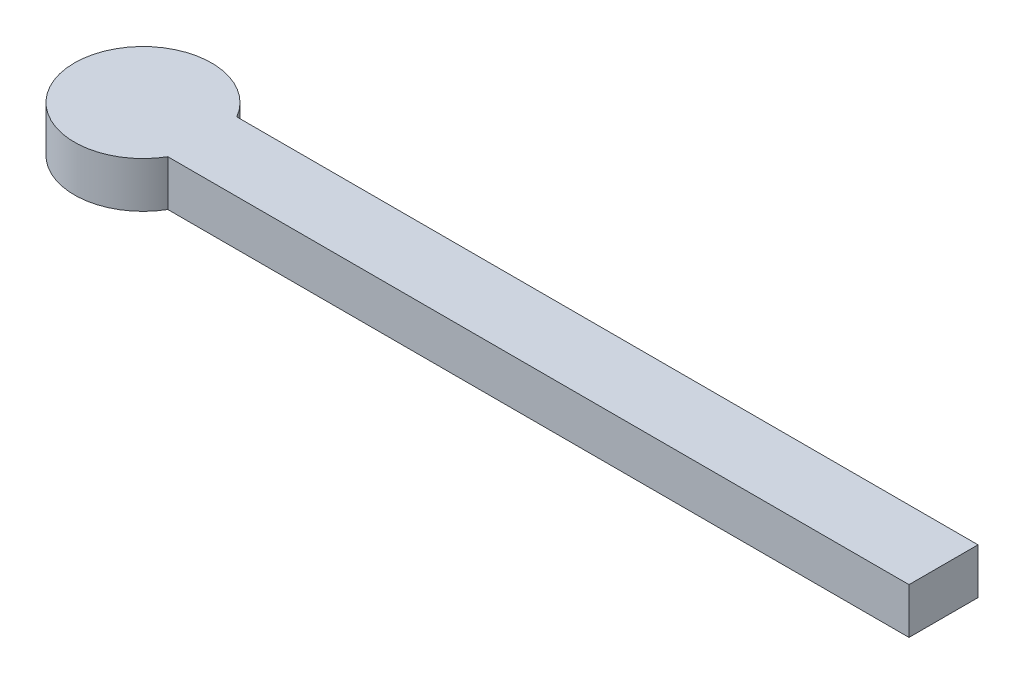
ISO-10303-21;
HEADER;
FILE_DESCRIPTION(('STEP AP214'),'2;1');
FILE_NAME('part.step','',(''),(''),'','','');
FILE_SCHEMA(('AUTOMOTIVE_DESIGN { 1 0 10303 214 1 1 1 1 }'));
ENDSEC;
DATA;
#1=APPLICATION_CONTEXT('core data for automotive mechanical design processes');
#2=APPLICATION_PROTOCOL_DEFINITION('international standard','automotive_design',2000,#1);
#3=PRODUCT_CONTEXT('',#1,'mechanical');
#4=PRODUCT('Part','Part','',(#3));
#5=PRODUCT_RELATED_PRODUCT_CATEGORY('part','',(#4));
#6=PRODUCT_DEFINITION_FORMATION('','',#4);
#7=PRODUCT_DEFINITION_CONTEXT('part definition',#1,'design');
#8=PRODUCT_DEFINITION('design','',#6,#7);
#9=PRODUCT_DEFINITION_SHAPE('','',#8);
#10=(LENGTH_UNIT() NAMED_UNIT(*) SI_UNIT(.MILLI.,.METRE.));
#11=(NAMED_UNIT(*) PLANE_ANGLE_UNIT() SI_UNIT($,.RADIAN.));
#12=(NAMED_UNIT(*) SI_UNIT($,.STERADIAN.) SOLID_ANGLE_UNIT());
#13=UNCERTAINTY_MEASURE_WITH_UNIT(LENGTH_MEASURE(1.E-05),#10,'distance_accuracy_value','');
#14=(GEOMETRIC_REPRESENTATION_CONTEXT(3) GLOBAL_UNCERTAINTY_ASSIGNED_CONTEXT((#13)) GLOBAL_UNIT_ASSIGNED_CONTEXT((#10,
#11,#12)) REPRESENTATION_CONTEXT('',''));
#15=CARTESIAN_POINT('',(0.,0.,0.));
#16=DIRECTION('',(0.,0.,1.));
#17=DIRECTION('',(1.,0.,0.));
#18=AXIS2_PLACEMENT_3D('',#15,#16,#17);
#19=CARTESIAN_POINT('',(0.,10.,0.));
#20=DIRECTION('',(0.,-1.,0.));
#21=DIRECTION('',(0.,0.,-1.));
#22=AXIS2_PLACEMENT_3D('',#19,#20,#21);
#23=CYLINDRICAL_SURFACE('',#22,15.);
#24=CARTESIAN_POINT('',(0.,0.,0.));
#25=DIRECTION('',(0.,1.,0.));
#26=DIRECTION('',(0.,0.,1.));
#27=AXIS2_PLACEMENT_3D('',#24,#25,#26);
#28=CIRCLE('',#27,15.);
#29=CARTESIAN_POINT('',(12.9676078002629,0.,-7.53930686061795));
#30=VERTEX_POINT('',#29);
#31=CARTESIAN_POINT('',(12.9676078002629,0.,7.53930686061795));
#32=VERTEX_POINT('',#31);
#33=EDGE_CURVE('E107',#30,#32,#28,.T.);
#34=ORIENTED_EDGE('',*,*,#33,.T.);
#35=DIRECTION('',(0.,-1.,0.));
#36=VECTOR('',#35,1.);
#37=CARTESIAN_POINT('',(12.9676078002629,10.,7.53930686061795));
#38=LINE('',#37,#36);
#39=CARTESIAN_POINT('',(12.9676078002629,10.,7.53930686061795));
#40=VERTEX_POINT('',#39);
#41=EDGE_CURVE('E11',#40,#32,#38,.T.);
#42=ORIENTED_EDGE('',*,*,#41,.F.);
#43=CARTESIAN_POINT('',(0.,10.,0.));
#44=DIRECTION('',(0.,1.,0.));
#45=DIRECTION('',(0.,0.,1.));
#46=AXIS2_PLACEMENT_3D('',#43,#44,#45);
#47=CIRCLE('',#46,15.);
#48=CARTESIAN_POINT('',(12.9676078002629,10.,-7.53930686061795));
#49=VERTEX_POINT('',#48);
#50=EDGE_CURVE('E91',#49,#40,#47,.T.);
#51=ORIENTED_EDGE('',*,*,#50,.F.);
#52=DIRECTION('',(0.,-1.,0.));
#53=VECTOR('',#52,1.);
#54=CARTESIAN_POINT('',(12.9676078002629,10.,-7.53930686061795));
#55=LINE('',#54,#53);
#56=EDGE_CURVE('E103',#49,#30,#55,.T.);
#57=ORIENTED_EDGE('',*,*,#56,.T.);
#58=EDGE_LOOP('',(#34,#42,#51,#57));
#59=FACE_BOUND('',#58,.T.);
#60=ADVANCED_FACE('F39',(#59),#23,.T.);
#61=CARTESIAN_POINT('',(174.957909360127,10.,7.53930686061795));
#62=DIRECTION('',(0.,0.,-1.));
#63=DIRECTION('',(-1.,0.,0.));
#64=AXIS2_PLACEMENT_3D('',#61,#62,#63);
#65=PLANE('',#64);
#66=DIRECTION('',(1.,0.,0.));
#67=VECTOR('',#66,1.);
#68=CARTESIAN_POINT('',(174.957909360127,0.,7.53930686061795));
#69=LINE('',#68,#67);
#70=CARTESIAN_POINT('',(174.957909360127,0.,7.53930686061795));
#71=VERTEX_POINT('',#70);
#72=EDGE_CURVE('E96',#32,#71,#69,.T.);
#73=ORIENTED_EDGE('',*,*,#72,.T.);
#74=DIRECTION('',(0.,-1.,0.));
#75=VECTOR('',#74,1.);
#76=CARTESIAN_POINT('',(174.957909360127,10.,7.53930686061795));
#77=LINE('',#76,#75);
#78=CARTESIAN_POINT('',(174.957909360127,10.,7.53930686061795));
#79=VERTEX_POINT('',#78);
#80=EDGE_CURVE('E48',#79,#71,#77,.T.);
#81=ORIENTED_EDGE('',*,*,#80,.F.);
#82=DIRECTION('',(1.,0.,0.));
#83=VECTOR('',#82,1.);
#84=CARTESIAN_POINT('',(174.957909360127,10.,7.53930686061795));
#85=LINE('',#84,#83);
#86=EDGE_CURVE('E86',#40,#79,#85,.T.);
#87=ORIENTED_EDGE('',*,*,#86,.F.);
#88=ORIENTED_EDGE('',*,*,#41,.T.);
#89=EDGE_LOOP('',(#73,#81,#87,#88));
#90=FACE_BOUND('',#89,.T.);
#91=ADVANCED_FACE('F95',(#90),#65,.F.);
#92=CARTESIAN_POINT('',(174.957909360127,10.,7.53930686061795));
#93=DIRECTION('',(-1.,0.,0.));
#94=DIRECTION('',(0.,0.,1.));
#95=AXIS2_PLACEMENT_3D('',#92,#93,#94);
#96=PLANE('',#95);
#97=DIRECTION('',(0.,0.,-1.));
#98=VECTOR('',#97,1.);
#99=CARTESIAN_POINT('',(174.957909360127,0.,7.53930686061795));
#100=LINE('',#99,#98);
#101=CARTESIAN_POINT('',(174.957909360127,0.,-7.53930686061795));
#102=VERTEX_POINT('',#101);
#103=EDGE_CURVE('E73',#71,#102,#100,.T.);
#104=ORIENTED_EDGE('',*,*,#103,.T.);
#105=DIRECTION('',(0.,-1.,0.));
#106=VECTOR('',#105,1.);
#107=CARTESIAN_POINT('',(174.957909360127,10.,-7.53930686061795));
#108=LINE('',#107,#106);
#109=CARTESIAN_POINT('',(174.957909360127,10.,-7.53930686061795));
#110=VERTEX_POINT('',#109);
#111=EDGE_CURVE('E98',#110,#102,#108,.T.);
#112=ORIENTED_EDGE('',*,*,#111,.F.);
#113=DIRECTION('',(0.,0.,-1.));
#114=VECTOR('',#113,1.);
#115=CARTESIAN_POINT('',(174.957909360127,10.,7.53930686061795));
#116=LINE('',#115,#114);
#117=EDGE_CURVE('E89',#79,#110,#116,.T.);
#118=ORIENTED_EDGE('',*,*,#117,.F.);
#119=ORIENTED_EDGE('',*,*,#80,.T.);
#120=EDGE_LOOP('',(#104,#112,#118,#119));
#121=FACE_BOUND('',#120,.T.);
#122=ADVANCED_FACE('F99',(#121),#96,.F.);
#123=CARTESIAN_POINT('',(174.957909360127,10.,-7.53930686061795));
#124=DIRECTION('',(0.,0.,1.));
#125=DIRECTION('',(1.,0.,0.));
#126=AXIS2_PLACEMENT_3D('',#123,#124,#125);
#127=PLANE('',#126);
#128=DIRECTION('',(-1.,0.,0.));
#129=VECTOR('',#128,1.);
#130=CARTESIAN_POINT('',(174.957909360127,0.,-7.53930686061795));
#131=LINE('',#130,#129);
#132=EDGE_CURVE('E79',#102,#30,#131,.T.);
#133=ORIENTED_EDGE('',*,*,#132,.T.);
#134=ORIENTED_EDGE('',*,*,#56,.F.);
#135=DIRECTION('',(-1.,0.,0.));
#136=VECTOR('',#135,1.);
#137=CARTESIAN_POINT('',(174.957909360127,10.,-7.53930686061795));
#138=LINE('',#137,#136);
#139=EDGE_CURVE('E56',#110,#49,#138,.T.);
#140=ORIENTED_EDGE('',*,*,#139,.F.);
#141=ORIENTED_EDGE('',*,*,#111,.T.);
#142=EDGE_LOOP('',(#133,#134,#140,#141));
#143=FACE_BOUND('',#142,.T.);
#144=ADVANCED_FACE('F120',(#143),#127,.F.);
#145=CARTESIAN_POINT('',(0.,10.,0.));
#146=DIRECTION('',(0.,1.,0.));
#147=DIRECTION('',(0.,0.,1.));
#148=AXIS2_PLACEMENT_3D('',#145,#146,#147);
#149=PLANE('',#148);
#150=ORIENTED_EDGE('',*,*,#50,.T.);
#151=ORIENTED_EDGE('',*,*,#86,.T.);
#152=ORIENTED_EDGE('',*,*,#117,.T.);
#153=ORIENTED_EDGE('',*,*,#139,.T.);
#154=EDGE_LOOP('',(#150,#151,#152,#153));
#155=FACE_BOUND('',#154,.T.);
#156=ADVANCED_FACE('F87',(#155),#149,.T.);
#157=CARTESIAN_POINT('',(0.,0.,0.));
#158=DIRECTION('',(0.,1.,0.));
#159=DIRECTION('',(0.,0.,1.));
#160=AXIS2_PLACEMENT_3D('',#157,#158,#159);
#161=PLANE('',#160);
#162=ORIENTED_EDGE('',*,*,#33,.F.);
#163=ORIENTED_EDGE('',*,*,#132,.F.);
#164=ORIENTED_EDGE('',*,*,#103,.F.);
#165=ORIENTED_EDGE('',*,*,#72,.F.);
#166=EDGE_LOOP('',(#162,#163,#164,#165));
#167=FACE_BOUND('',#166,.T.);
#168=ADVANCED_FACE('F123',(#167),#161,.F.);
#169=CLOSED_SHELL('',(#60,#91,#122,#144,#156,#168));
#170=MANIFOLD_SOLID_BREP('B2',#169);
#171=ADVANCED_BREP_SHAPE_REPRESENTATION('',(#18,#170),#14);
#172=SHAPE_DEFINITION_REPRESENTATION(#9,#171);
ENDSEC;
END-ISO-10303-21;
